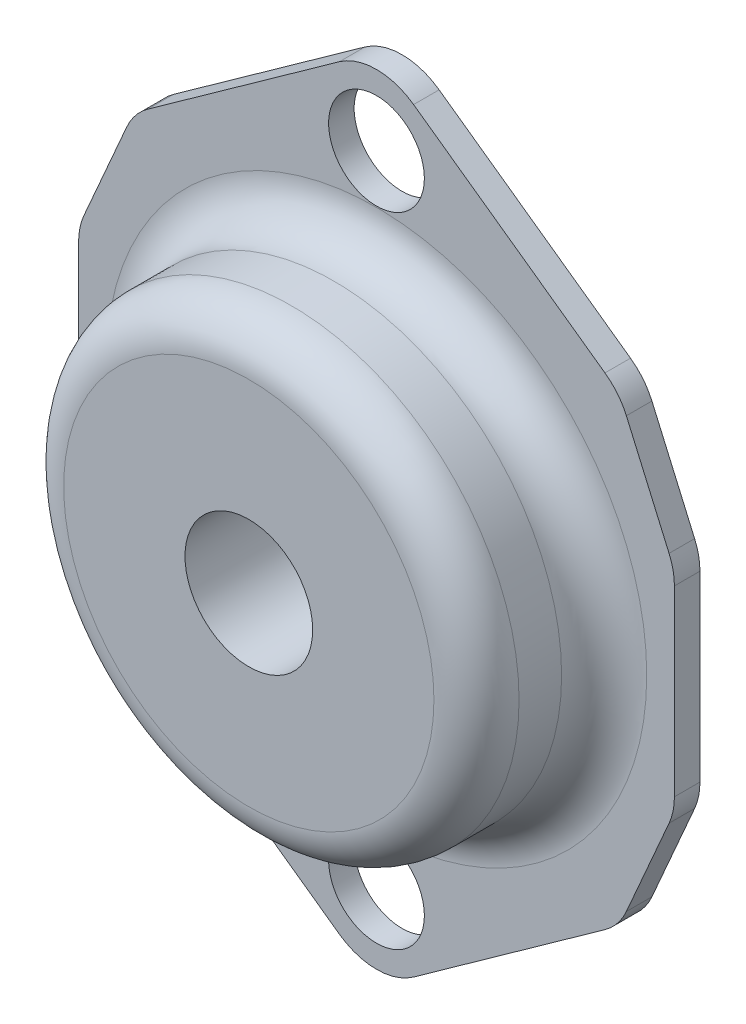
ISO-10303-21;
HEADER;
FILE_DESCRIPTION(('STEP AP214'),'2;1');
FILE_NAME('part.step','',(''),(''),'','','');
FILE_SCHEMA(('AUTOMOTIVE_DESIGN { 1 0 10303 214 1 1 1 1 }'));
ENDSEC;
DATA;
#1=APPLICATION_CONTEXT('core data for automotive mechanical design processes');
#2=APPLICATION_PROTOCOL_DEFINITION('international standard','automotive_design',2000,#1);
#3=PRODUCT_CONTEXT('',#1,'mechanical');
#4=PRODUCT('Part','Part','',(#3));
#5=PRODUCT_RELATED_PRODUCT_CATEGORY('part','',(#4));
#6=PRODUCT_DEFINITION_FORMATION('','',#4);
#7=PRODUCT_DEFINITION_CONTEXT('part definition',#1,'design');
#8=PRODUCT_DEFINITION('design','',#6,#7);
#9=PRODUCT_DEFINITION_SHAPE('','',#8);
#10=(LENGTH_UNIT() NAMED_UNIT(*) SI_UNIT(.MILLI.,.METRE.));
#11=(NAMED_UNIT(*) PLANE_ANGLE_UNIT() SI_UNIT($,.RADIAN.));
#12=(NAMED_UNIT(*) SI_UNIT($,.STERADIAN.) SOLID_ANGLE_UNIT());
#13=UNCERTAINTY_MEASURE_WITH_UNIT(LENGTH_MEASURE(1.E-05),#10,'distance_accuracy_value','');
#14=(GEOMETRIC_REPRESENTATION_CONTEXT(3) GLOBAL_UNCERTAINTY_ASSIGNED_CONTEXT((#13)) GLOBAL_UNIT_ASSIGNED_CONTEXT((#10,
#11,#12)) REPRESENTATION_CONTEXT('',''));
#15=CARTESIAN_POINT('',(0.,0.,0.));
#16=DIRECTION('',(0.,0.,1.));
#17=DIRECTION('',(1.,0.,0.));
#18=AXIS2_PLACEMENT_3D('',#15,#16,#17);
#19=CARTESIAN_POINT('',(8.98695474681683,12.5797149833493,1.2));
#20=DIRECTION('',(-0.581300041044602,-0.813689290995982,0.));
#21=DIRECTION('',(0.813689290995983,-0.581300041044602,0.));
#22=AXIS2_PLACEMENT_3D('',#19,#20,#21);
#23=PLANE('',#22);
#24=DIRECTION('',(-0.813689290995982,0.581300041044602,0.));
#25=VECTOR('',#24,1.);
#26=CARTESIAN_POINT('',(8.98695474681683,12.5797149833493,1.2));
#27=LINE('',#26,#25);
#28=CARTESIAN_POINT('',(10.7371772402966,11.3293551487599,1.2));
#29=VERTEX_POINT('',#28);
#30=CARTESIAN_POINT('',(1.7439001231338,17.7541568699835,1.2));
#31=VERTEX_POINT('',#30);
#32=EDGE_CURVE('E343',#29,#31,#27,.T.);
#33=ORIENTED_EDGE('',*,*,#32,.F.);
#34=DIRECTION('',(0.,0.,-1.));
#35=VECTOR('',#34,1.);
#36=CARTESIAN_POINT('',(10.7371772402966,11.3293551487599,1.2));
#37=LINE('',#36,#35);
#38=CARTESIAN_POINT('',(10.7371772402966,11.3293551487599,0.));
#39=VERTEX_POINT('',#38);
#40=EDGE_CURVE('E297',#29,#39,#37,.T.);
#41=ORIENTED_EDGE('',*,*,#40,.T.);
#42=DIRECTION('',(-0.813689290995982,0.581300041044602,0.));
#43=VECTOR('',#42,1.);
#44=CARTESIAN_POINT('',(8.98695474681683,12.5797149833493,0.));
#45=LINE('',#44,#43);
#46=CARTESIAN_POINT('',(1.7439001231338,17.7541568699835,0.));
#47=VERTEX_POINT('',#46);
#48=EDGE_CURVE('E373',#39,#47,#45,.T.);
#49=ORIENTED_EDGE('',*,*,#48,.T.);
#50=DIRECTION('',(0.,0.,-1.));
#51=VECTOR('',#50,1.);
#52=CARTESIAN_POINT('',(1.7439001231338,17.7541568699835,1.2));
#53=LINE('',#52,#51);
#54=EDGE_CURVE('E295',#47,#31,#53,.F.);
#55=ORIENTED_EDGE('',*,*,#54,.T.);
#56=EDGE_LOOP('',(#33,#41,#49,#55));
#57=FACE_BOUND('',#56,.T.);
#58=ADVANCED_FACE('F41',(#57),#23,.F.);
#59=CARTESIAN_POINT('',(-8.98695474681683,12.5797149833493,1.2));
#60=DIRECTION('',(-0.581300041044602,0.813689290995982,0.));
#61=DIRECTION('',(-0.813689290995983,-0.581300041044602,0.));
#62=AXIS2_PLACEMENT_3D('',#59,#60,#61);
#63=PLANE('',#62);
#64=DIRECTION('',(0.813689290995982,0.581300041044602,0.));
#65=VECTOR('',#64,1.);
#66=CARTESIAN_POINT('',(-8.98695474681683,12.5797149833493,0.));
#67=LINE('',#66,#65);
#68=CARTESIAN_POINT('',(-10.7371772402966,11.3293551487599,0.));
#69=VERTEX_POINT('',#68);
#70=CARTESIAN_POINT('',(-1.7439001231338,17.7541568699835,0.));
#71=VERTEX_POINT('',#70);
#72=EDGE_CURVE('E376',#69,#71,#67,.T.);
#73=ORIENTED_EDGE('',*,*,#72,.F.);
#74=DIRECTION('',(0.,0.,-1.));
#75=VECTOR('',#74,1.);
#76=CARTESIAN_POINT('',(-10.7371772402966,11.3293551487599,1.2));
#77=LINE('',#76,#75);
#78=CARTESIAN_POINT('',(-10.7371772402966,11.3293551487599,1.2));
#79=VERTEX_POINT('',#78);
#80=EDGE_CURVE('E308',#69,#79,#77,.F.);
#81=ORIENTED_EDGE('',*,*,#80,.T.);
#82=DIRECTION('',(0.813689290995982,0.581300041044602,0.));
#83=VECTOR('',#82,1.);
#84=CARTESIAN_POINT('',(-8.98695474681683,12.5797149833493,1.2));
#85=LINE('',#84,#83);
#86=CARTESIAN_POINT('',(-1.7439001231338,17.7541568699835,1.2));
#87=VERTEX_POINT('',#86);
#88=EDGE_CURVE('E346',#79,#87,#85,.T.);
#89=ORIENTED_EDGE('',*,*,#88,.T.);
#90=DIRECTION('',(0.,0.,-1.));
#91=VECTOR('',#90,1.);
#92=CARTESIAN_POINT('',(-1.7439001231338,17.7541568699835,0.));
#93=LINE('',#92,#91);
#94=EDGE_CURVE('E305',#87,#71,#93,.T.);
#95=ORIENTED_EDGE('',*,*,#94,.T.);
#96=EDGE_LOOP('',(#73,#81,#89,#95));
#97=FACE_BOUND('',#96,.T.);
#98=ADVANCED_FACE('F403',(#97),#63,.T.);
#99=CARTESIAN_POINT('',(-13.5622988799919,5.91998786113533,1.2));
#100=DIRECTION('',(-0.916492460327048,0.400051959329879,0.));
#101=DIRECTION('',(-0.400051959329879,-0.916492460327048,0.));
#102=AXIS2_PLACEMENT_3D('',#99,#100,#101);
#103=PLANE('',#102);
#104=DIRECTION('',(0.400051959329879,0.916492460327048,0.));
#105=VECTOR('',#104,1.);
#106=CARTESIAN_POINT('',(-13.5622988799919,5.91998786113533,0.));
#107=LINE('',#106,#105);
#108=CARTESIAN_POINT('',(-13.7494773809811,5.491174351062,0.));
#109=VERTEX_POINT('',#108);
#110=CARTESIAN_POINT('',(-11.7427544981439,10.0884431537616,0.));
#111=VERTEX_POINT('',#110);
#112=EDGE_CURVE('E213',#109,#111,#107,.T.);
#113=ORIENTED_EDGE('',*,*,#112,.F.);
#114=DIRECTION('',(0.,0.,-1.));
#115=VECTOR('',#114,1.);
#116=CARTESIAN_POINT('',(-13.7494773809811,5.491174351062,1.2));
#117=LINE('',#116,#115);
#118=CARTESIAN_POINT('',(-13.7494773809811,5.491174351062,1.2));
#119=VERTEX_POINT('',#118);
#120=EDGE_CURVE('E303',#109,#119,#117,.F.);
#121=ORIENTED_EDGE('',*,*,#120,.T.);
#122=DIRECTION('',(0.400051959329879,0.916492460327048,0.));
#123=VECTOR('',#122,1.);
#124=CARTESIAN_POINT('',(-13.5622988799919,5.91998786113533,1.2));
#125=LINE('',#124,#123);
#126=CARTESIAN_POINT('',(-11.7427544981439,10.0884431537616,1.2));
#127=VERTEX_POINT('',#126);
#128=EDGE_CURVE('E349',#119,#127,#125,.T.);
#129=ORIENTED_EDGE('',*,*,#128,.T.);
#130=DIRECTION('',(0.,0.,-1.));
#131=VECTOR('',#130,1.);
#132=CARTESIAN_POINT('',(-11.7427544981439,10.0884431537616,1.2));
#133=LINE('',#132,#131);
#134=EDGE_CURVE('E300',#127,#111,#133,.T.);
#135=ORIENTED_EDGE('',*,*,#134,.T.);
#136=EDGE_LOOP('',(#113,#121,#129,#135));
#137=FACE_BOUND('',#136,.T.);
#138=ADVANCED_FACE('F383',(#137),#103,.T.);
#139=CARTESIAN_POINT('',(-14.,0.,1.2));
#140=DIRECTION('',(-1.,0.,0.));
#141=DIRECTION('',(0.,0.,1.));
#142=AXIS2_PLACEMENT_3D('',#139,#140,#141);
#143=PLANE('',#142);
#144=DIRECTION('',(0.,1.,0.));
#145=VECTOR('',#144,1.);
#146=CARTESIAN_POINT('',(-14.,0.,0.));
#147=LINE('',#146,#145);
#148=CARTESIAN_POINT('',(-14.,-4.29101847307236,0.));
#149=VERTEX_POINT('',#148);
#150=CARTESIAN_POINT('',(-14.,4.29101847307236,0.));
#151=VERTEX_POINT('',#150);
#152=EDGE_CURVE('E208',#149,#151,#147,.T.);
#153=ORIENTED_EDGE('',*,*,#152,.F.);
#154=DIRECTION('',(0.,0.,-1.));
#155=VECTOR('',#154,1.);
#156=CARTESIAN_POINT('',(-14.,-4.29101847307236,1.2));
#157=LINE('',#156,#155);
#158=CARTESIAN_POINT('',(-14.,-4.29101847307236,1.2));
#159=VERTEX_POINT('',#158);
#160=EDGE_CURVE('E185',#149,#159,#157,.F.);
#161=ORIENTED_EDGE('',*,*,#160,.T.);
#162=DIRECTION('',(0.,1.,0.));
#163=VECTOR('',#162,1.);
#164=CARTESIAN_POINT('',(-14.,0.,1.2));
#165=LINE('',#164,#163);
#166=CARTESIAN_POINT('',(-14.,4.29101847307236,1.2));
#167=VERTEX_POINT('',#166);
#168=EDGE_CURVE('E352',#159,#167,#165,.T.);
#169=ORIENTED_EDGE('',*,*,#168,.T.);
#170=DIRECTION('',(0.,0.,-1.));
#171=VECTOR('',#170,1.);
#172=CARTESIAN_POINT('',(-14.,4.29101847307236,1.2));
#173=LINE('',#172,#171);
#174=EDGE_CURVE('E190',#167,#151,#173,.T.);
#175=ORIENTED_EDGE('',*,*,#174,.T.);
#176=EDGE_LOOP('',(#153,#161,#169,#175));
#177=FACE_BOUND('',#176,.T.);
#178=ADVANCED_FACE('F394',(#177),#143,.T.);
#179=CARTESIAN_POINT('',(-13.5622988799919,-5.91998786113533,1.2));
#180=DIRECTION('',(0.916492460327048,0.400051959329879,0.));
#181=DIRECTION('',(-0.400051959329879,0.916492460327048,0.));
#182=AXIS2_PLACEMENT_3D('',#179,#180,#181);
#183=PLANE('',#182);
#184=DIRECTION('',(0.400051959329879,-0.916492460327048,0.));
#185=VECTOR('',#184,1.);
#186=CARTESIAN_POINT('',(-13.5622988799919,-5.91998786113533,1.2));
#187=LINE('',#186,#185);
#188=CARTESIAN_POINT('',(-13.7494773809811,-5.491174351062,1.2));
#189=VERTEX_POINT('',#188);
#190=CARTESIAN_POINT('',(-11.7427544981439,-10.0884431537616,1.2));
#191=VERTEX_POINT('',#190);
#192=EDGE_CURVE('E200',#189,#191,#187,.T.);
#193=ORIENTED_EDGE('',*,*,#192,.F.);
#194=DIRECTION('',(0.,0.,-1.));
#195=VECTOR('',#194,1.);
#196=CARTESIAN_POINT('',(-13.7494773809811,-5.491174351062,0.));
#197=LINE('',#196,#195);
#198=CARTESIAN_POINT('',(-13.7494773809811,-5.491174351062,0.));
#199=VERTEX_POINT('',#198);
#200=EDGE_CURVE('E184',#189,#199,#197,.T.);
#201=ORIENTED_EDGE('',*,*,#200,.T.);
#202=DIRECTION('',(0.400051959329879,-0.916492460327048,0.));
#203=VECTOR('',#202,1.);
#204=CARTESIAN_POINT('',(-13.5622988799919,-5.91998786113533,0.));
#205=LINE('',#204,#203);
#206=CARTESIAN_POINT('',(-11.7427544981439,-10.0884431537616,0.));
#207=VERTEX_POINT('',#206);
#208=EDGE_CURVE('E197',#199,#207,#205,.T.);
#209=ORIENTED_EDGE('',*,*,#208,.T.);
#210=DIRECTION('',(0.,0.,-1.));
#211=VECTOR('',#210,1.);
#212=CARTESIAN_POINT('',(-11.7427544981439,-10.0884431537616,1.2));
#213=LINE('',#212,#211);
#214=EDGE_CURVE('E202',#207,#191,#213,.F.);
#215=ORIENTED_EDGE('',*,*,#214,.T.);
#216=EDGE_LOOP('',(#193,#201,#209,#215));
#217=FACE_BOUND('',#216,.T.);
#218=ADVANCED_FACE('F196',(#217),#183,.F.);
#219=CARTESIAN_POINT('',(-8.98695474681683,-12.5797149833493,1.2));
#220=DIRECTION('',(0.581300041044602,0.813689290995982,0.));
#221=DIRECTION('',(-0.813689290995983,0.581300041044602,0.));
#222=AXIS2_PLACEMENT_3D('',#219,#220,#221);
#223=PLANE('',#222);
#224=DIRECTION('',(0.813689290995982,-0.581300041044602,0.));
#225=VECTOR('',#224,1.);
#226=CARTESIAN_POINT('',(-8.98695474681683,-12.5797149833493,1.2));
#227=LINE('',#226,#225);
#228=CARTESIAN_POINT('',(-10.7371772402966,-11.3293551487599,1.2));
#229=VERTEX_POINT('',#228);
#230=CARTESIAN_POINT('',(-1.7439001231338,-17.7541568699835,1.2));
#231=VERTEX_POINT('',#230);
#232=EDGE_CURVE('E356',#229,#231,#227,.T.);
#233=ORIENTED_EDGE('',*,*,#232,.F.);
#234=DIRECTION('',(0.,0.,-1.));
#235=VECTOR('',#234,1.);
#236=CARTESIAN_POINT('',(-10.7371772402966,-11.3293551487599,1.2));
#237=LINE('',#236,#235);
#238=CARTESIAN_POINT('',(-10.7371772402966,-11.3293551487599,0.));
#239=VERTEX_POINT('',#238);
#240=EDGE_CURVE('E273',#229,#239,#237,.T.);
#241=ORIENTED_EDGE('',*,*,#240,.T.);
#242=DIRECTION('',(0.813689290995982,-0.581300041044602,0.));
#243=VECTOR('',#242,1.);
#244=CARTESIAN_POINT('',(-8.98695474681683,-12.5797149833493,0.));
#245=LINE('',#244,#243);
#246=CARTESIAN_POINT('',(-1.7439001231338,-17.7541568699835,0.));
#247=VERTEX_POINT('',#246);
#248=EDGE_CURVE('E207',#239,#247,#245,.T.);
#249=ORIENTED_EDGE('',*,*,#248,.T.);
#250=DIRECTION('',(0.,0.,-1.));
#251=VECTOR('',#250,1.);
#252=CARTESIAN_POINT('',(-1.7439001231338,-17.7541568699835,1.2));
#253=LINE('',#252,#251);
#254=EDGE_CURVE('E271',#247,#231,#253,.F.);
#255=ORIENTED_EDGE('',*,*,#254,.T.);
#256=EDGE_LOOP('',(#233,#241,#249,#255));
#257=FACE_BOUND('',#256,.T.);
#258=ADVANCED_FACE('F401',(#257),#223,.F.);
#259=CARTESIAN_POINT('',(8.98695474681683,-12.5797149833493,1.2));
#260=DIRECTION('',(0.581300041044602,-0.813689290995982,0.));
#261=DIRECTION('',(0.813689290995983,0.581300041044602,0.));
#262=AXIS2_PLACEMENT_3D('',#259,#260,#261);
#263=PLANE('',#262);
#264=DIRECTION('',(-0.813689290995982,-0.581300041044602,0.));
#265=VECTOR('',#264,1.);
#266=CARTESIAN_POINT('',(8.98695474681683,-12.5797149833493,1.2));
#267=LINE('',#266,#265);
#268=CARTESIAN_POINT('',(10.7371772402966,-11.3293551487599,1.2));
#269=VERTEX_POINT('',#268);
#270=CARTESIAN_POINT('',(1.7439001231338,-17.7541568699835,1.2));
#271=VERTEX_POINT('',#270);
#272=EDGE_CURVE('E359',#269,#271,#267,.T.);
#273=ORIENTED_EDGE('',*,*,#272,.T.);
#274=DIRECTION('',(0.,0.,-1.));
#275=VECTOR('',#274,1.);
#276=CARTESIAN_POINT('',(1.7439001231338,-17.7541568699835,0.));
#277=LINE('',#276,#275);
#278=CARTESIAN_POINT('',(1.7439001231338,-17.7541568699835,0.));
#279=VERTEX_POINT('',#278);
#280=EDGE_CURVE('E278',#271,#279,#277,.T.);
#281=ORIENTED_EDGE('',*,*,#280,.T.);
#282=DIRECTION('',(-0.813689290995982,-0.581300041044602,0.));
#283=VECTOR('',#282,1.);
#284=CARTESIAN_POINT('',(8.98695474681683,-12.5797149833493,0.));
#285=LINE('',#284,#283);
#286=CARTESIAN_POINT('',(10.7371772402966,-11.3293551487599,0.));
#287=VERTEX_POINT('',#286);
#288=EDGE_CURVE('E211',#287,#279,#285,.T.);
#289=ORIENTED_EDGE('',*,*,#288,.F.);
#290=DIRECTION('',(0.,0.,-1.));
#291=VECTOR('',#290,1.);
#292=CARTESIAN_POINT('',(10.7371772402966,-11.3293551487599,1.2));
#293=LINE('',#292,#291);
#294=EDGE_CURVE('E276',#287,#269,#293,.F.);
#295=ORIENTED_EDGE('',*,*,#294,.T.);
#296=EDGE_LOOP('',(#273,#281,#289,#295));
#297=FACE_BOUND('',#296,.T.);
#298=ADVANCED_FACE('F490',(#297),#263,.T.);
#299=CARTESIAN_POINT('',(13.5622988799919,-5.91998786113533,1.2));
#300=DIRECTION('',(0.916492460327048,-0.400051959329879,0.));
#301=DIRECTION('',(0.400051959329879,0.916492460327048,0.));
#302=AXIS2_PLACEMENT_3D('',#299,#300,#301);
#303=PLANE('',#302);
#304=DIRECTION('',(-0.400051959329879,-0.916492460327048,0.));
#305=VECTOR('',#304,1.);
#306=CARTESIAN_POINT('',(13.5622988799919,-5.91998786113533,1.2));
#307=LINE('',#306,#305);
#308=CARTESIAN_POINT('',(13.7494773809811,-5.491174351062,1.2));
#309=VERTEX_POINT('',#308);
#310=CARTESIAN_POINT('',(11.7427544981439,-10.0884431537616,1.2));
#311=VERTEX_POINT('',#310);
#312=EDGE_CURVE('E362',#309,#311,#307,.T.);
#313=ORIENTED_EDGE('',*,*,#312,.T.);
#314=DIRECTION('',(0.,0.,-1.));
#315=VECTOR('',#314,1.);
#316=CARTESIAN_POINT('',(11.7427544981439,-10.0884431537616,1.2));
#317=LINE('',#316,#315);
#318=CARTESIAN_POINT('',(11.7427544981439,-10.0884431537616,0.));
#319=VERTEX_POINT('',#318);
#320=EDGE_CURVE('E283',#311,#319,#317,.T.);
#321=ORIENTED_EDGE('',*,*,#320,.T.);
#322=DIRECTION('',(-0.400051959329879,-0.916492460327048,0.));
#323=VECTOR('',#322,1.);
#324=CARTESIAN_POINT('',(13.5622988799919,-5.91998786113533,0.));
#325=LINE('',#324,#323);
#326=CARTESIAN_POINT('',(13.7494773809811,-5.491174351062,0.));
#327=VERTEX_POINT('',#326);
#328=EDGE_CURVE('E219',#327,#319,#325,.T.);
#329=ORIENTED_EDGE('',*,*,#328,.F.);
#330=DIRECTION('',(0.,0.,-1.));
#331=VECTOR('',#330,1.);
#332=CARTESIAN_POINT('',(13.7494773809811,-5.491174351062,1.2));
#333=LINE('',#332,#331);
#334=EDGE_CURVE('E281',#327,#309,#333,.F.);
#335=ORIENTED_EDGE('',*,*,#334,.T.);
#336=EDGE_LOOP('',(#313,#321,#329,#335));
#337=FACE_BOUND('',#336,.T.);
#338=ADVANCED_FACE('F483',(#337),#303,.T.);
#339=CARTESIAN_POINT('',(14.,0.,1.2));
#340=DIRECTION('',(-1.,0.,0.));
#341=DIRECTION('',(0.,0.,1.));
#342=AXIS2_PLACEMENT_3D('',#339,#340,#341);
#343=PLANE('',#342);
#344=DIRECTION('',(0.,1.,0.));
#345=VECTOR('',#344,1.);
#346=CARTESIAN_POINT('',(14.,0.,1.2));
#347=LINE('',#346,#345);
#348=CARTESIAN_POINT('',(14.,-4.29101847307236,1.2));
#349=VERTEX_POINT('',#348);
#350=CARTESIAN_POINT('',(14.,4.29101847307236,1.2));
#351=VERTEX_POINT('',#350);
#352=EDGE_CURVE('E365',#349,#351,#347,.T.);
#353=ORIENTED_EDGE('',*,*,#352,.F.);
#354=DIRECTION('',(0.,0.,-1.));
#355=VECTOR('',#354,1.);
#356=CARTESIAN_POINT('',(14.,-4.29101847307236,0.));
#357=LINE('',#356,#355);
#358=CARTESIAN_POINT('',(14.,-4.29101847307236,0.));
#359=VERTEX_POINT('',#358);
#360=EDGE_CURVE('E288',#349,#359,#357,.T.);
#361=ORIENTED_EDGE('',*,*,#360,.T.);
#362=DIRECTION('',(0.,1.,0.));
#363=VECTOR('',#362,1.);
#364=CARTESIAN_POINT('',(14.,0.,0.));
#365=LINE('',#364,#363);
#366=CARTESIAN_POINT('',(14.,4.29101847307236,0.));
#367=VERTEX_POINT('',#366);
#368=EDGE_CURVE('E222',#359,#367,#365,.T.);
#369=ORIENTED_EDGE('',*,*,#368,.T.);
#370=DIRECTION('',(0.,0.,-1.));
#371=VECTOR('',#370,1.);
#372=CARTESIAN_POINT('',(14.,4.29101847307236,1.2));
#373=LINE('',#372,#371);
#374=EDGE_CURVE('E286',#367,#351,#373,.F.);
#375=ORIENTED_EDGE('',*,*,#374,.T.);
#376=EDGE_LOOP('',(#353,#361,#369,#375));
#377=FACE_BOUND('',#376,.T.);
#378=ADVANCED_FACE('F477',(#377),#343,.F.);
#379=CARTESIAN_POINT('',(13.5622988799919,5.91998786113533,1.2));
#380=DIRECTION('',(-0.916492460327048,-0.400051959329879,0.));
#381=DIRECTION('',(0.400051959329879,-0.916492460327048,0.));
#382=AXIS2_PLACEMENT_3D('',#379,#380,#381);
#383=PLANE('',#382);
#384=DIRECTION('',(-0.400051959329879,0.916492460327048,0.));
#385=VECTOR('',#384,1.);
#386=CARTESIAN_POINT('',(13.5622988799919,5.91998786113533,1.2));
#387=LINE('',#386,#385);
#388=CARTESIAN_POINT('',(13.7494773809811,5.491174351062,1.2));
#389=VERTEX_POINT('',#388);
#390=CARTESIAN_POINT('',(11.7427544981439,10.0884431537616,1.2));
#391=VERTEX_POINT('',#390);
#392=EDGE_CURVE('E367',#389,#391,#387,.T.);
#393=ORIENTED_EDGE('',*,*,#392,.F.);
#394=DIRECTION('',(0.,0.,-1.));
#395=VECTOR('',#394,1.);
#396=CARTESIAN_POINT('',(13.7494773809811,5.491174351062,1.2));
#397=LINE('',#396,#395);
#398=CARTESIAN_POINT('',(13.7494773809811,5.491174351062,0.));
#399=VERTEX_POINT('',#398);
#400=EDGE_CURVE('E292',#389,#399,#397,.T.);
#401=ORIENTED_EDGE('',*,*,#400,.T.);
#402=DIRECTION('',(-0.400051959329879,0.916492460327048,0.));
#403=VECTOR('',#402,1.);
#404=CARTESIAN_POINT('',(13.5622988799919,5.91998786113533,0.));
#405=LINE('',#404,#403);
#406=CARTESIAN_POINT('',(11.7427544981439,10.0884431537616,0.));
#407=VERTEX_POINT('',#406);
#408=EDGE_CURVE('E225',#399,#407,#405,.T.);
#409=ORIENTED_EDGE('',*,*,#408,.T.);
#410=DIRECTION('',(0.,0.,-1.));
#411=VECTOR('',#410,1.);
#412=CARTESIAN_POINT('',(11.7427544981439,10.0884431537616,1.2));
#413=LINE('',#412,#411);
#414=EDGE_CURVE('E56',#407,#391,#413,.F.);
#415=ORIENTED_EDGE('',*,*,#414,.T.);
#416=EDGE_LOOP('',(#393,#401,#409,#415));
#417=FACE_BOUND('',#416,.T.);
#418=ADVANCED_FACE('F420',(#417),#383,.F.);
#419=CARTESIAN_POINT('',(0.,15.,1.2));
#420=DIRECTION('',(0.,0.,-1.));
#421=DIRECTION('',(-1.,0.,0.));
#422=AXIS2_PLACEMENT_3D('',#419,#420,#421);
#423=CYLINDRICAL_SURFACE('',#422,2.25);
#424=CARTESIAN_POINT('',(0.,15.,1.2));
#425=DIRECTION('',(0.,0.,1.));
#426=DIRECTION('',(1.,0.,0.));
#427=AXIS2_PLACEMENT_3D('',#424,#425,#426);
#428=CIRCLE('',#427,2.25);
#429=CARTESIAN_POINT('',(2.25,15.,1.2));
#430=VERTEX_POINT('',#429);
#431=EDGE_CURVE('E230',#430,#430,#428,.T.);
#432=ORIENTED_EDGE('',*,*,#431,.T.);
#433=EDGE_LOOP('',(#432));
#434=FACE_BOUND('',#433,.T.);
#435=CARTESIAN_POINT('',(0.,15.,0.));
#436=DIRECTION('',(0.,0.,1.));
#437=DIRECTION('',(1.,0.,0.));
#438=AXIS2_PLACEMENT_3D('',#435,#436,#437);
#439=CIRCLE('',#438,2.25);
#440=CARTESIAN_POINT('',(2.25,15.,0.));
#441=VERTEX_POINT('',#440);
#442=EDGE_CURVE('E338',#441,#441,#439,.T.);
#443=ORIENTED_EDGE('',*,*,#442,.F.);
#444=EDGE_LOOP('',(#443));
#445=FACE_BOUND('',#444,.T.);
#446=ADVANCED_FACE('F416',(#434,#445),#423,.F.);
#447=CARTESIAN_POINT('',(0.,0.,1.2));
#448=DIRECTION('',(0.,0.,-1.));
#449=DIRECTION('',(-1.,0.,0.));
#450=AXIS2_PLACEMENT_3D('',#447,#448,#449);
#451=CYLINDRICAL_SURFACE('',#450,3.);
#452=CARTESIAN_POINT('',(0.,0.,0.));
#453=DIRECTION('',(0.,0.,1.));
#454=DIRECTION('',(1.,0.,0.));
#455=AXIS2_PLACEMENT_3D('',#452,#453,#454);
#456=CIRCLE('',#455,3.);
#457=CARTESIAN_POINT('',(3.,0.,0.));
#458=VERTEX_POINT('',#457);
#459=EDGE_CURVE('E335',#458,#458,#456,.T.);
#460=ORIENTED_EDGE('',*,*,#459,.F.);
#461=EDGE_LOOP('',(#460));
#462=FACE_BOUND('',#461,.T.);
#463=CARTESIAN_POINT('',(0.,0.,7.2));
#464=DIRECTION('',(0.,0.,1.));
#465=DIRECTION('',(1.,0.,0.));
#466=AXIS2_PLACEMENT_3D('',#463,#464,#465);
#467=CIRCLE('',#466,3.);
#468=CARTESIAN_POINT('',(3.,0.,7.2));
#469=VERTEX_POINT('',#468);
#470=EDGE_CURVE('E333',#469,#469,#467,.F.);
#471=ORIENTED_EDGE('',*,*,#470,.F.);
#472=EDGE_LOOP('',(#471));
#473=FACE_BOUND('',#472,.T.);
#474=ADVANCED_FACE('F419',(#462,#473),#451,.F.);
#475=CARTESIAN_POINT('',(0.,-15.,1.2));
#476=DIRECTION('',(0.,0.,-1.));
#477=DIRECTION('',(-1.,0.,0.));
#478=AXIS2_PLACEMENT_3D('',#475,#476,#477);
#479=CYLINDRICAL_SURFACE('',#478,2.25);
#480=CARTESIAN_POINT('',(0.,-15.,1.2));
#481=DIRECTION('',(0.,0.,1.));
#482=DIRECTION('',(1.,0.,0.));
#483=AXIS2_PLACEMENT_3D('',#480,#481,#482);
#484=CIRCLE('',#483,2.25);
#485=CARTESIAN_POINT('',(2.25,-15.,1.2));
#486=VERTEX_POINT('',#485);
#487=EDGE_CURVE('E231',#486,#486,#484,.T.);
#488=ORIENTED_EDGE('',*,*,#487,.T.);
#489=EDGE_LOOP('',(#488));
#490=FACE_BOUND('',#489,.T.);
#491=CARTESIAN_POINT('',(0.,-15.,0.));
#492=DIRECTION('',(0.,0.,1.));
#493=DIRECTION('',(1.,0.,0.));
#494=AXIS2_PLACEMENT_3D('',#491,#492,#493);
#495=CIRCLE('',#494,2.25);
#496=CARTESIAN_POINT('',(2.25,-15.,0.));
#497=VERTEX_POINT('',#496);
#498=EDGE_CURVE('E227',#497,#497,#495,.T.);
#499=ORIENTED_EDGE('',*,*,#498,.F.);
#500=EDGE_LOOP('',(#499));
#501=FACE_BOUND('',#500,.T.);
#502=ADVANCED_FACE('F424',(#490,#501),#479,.F.);
#503=CARTESIAN_POINT('',(0.,0.,1.2));
#504=DIRECTION('',(0.,0.,1.));
#505=DIRECTION('',(1.,0.,0.));
#506=AXIS2_PLACEMENT_3D('',#503,#504,#505);
#507=PLANE('',#506);
#508=CARTESIAN_POINT('',(0.,0.,1.2));
#509=DIRECTION('',(0.,0.,1.));
#510=DIRECTION('',(1.,0.,0.));
#511=AXIS2_PLACEMENT_3D('',#508,#509,#510);
#512=CIRCLE('',#511,12.7);
#513=CARTESIAN_POINT('',(12.7,0.,1.2));
#514=VERTEX_POINT('',#513);
#515=EDGE_CURVE('E11',#514,#514,#512,.F.);
#516=ORIENTED_EDGE('',*,*,#515,.T.);
#517=EDGE_LOOP('',(#516));
#518=FACE_BOUND('',#517,.T.);
#519=ORIENTED_EDGE('',*,*,#431,.F.);
#520=EDGE_LOOP('',(#519));
#521=FACE_BOUND('',#520,.T.);
#522=ORIENTED_EDGE('',*,*,#168,.F.);
#523=CARTESIAN_POINT('',(-11.,-4.29101847307236,1.2));
#524=DIRECTION('',(0.,0.,1.));
#525=DIRECTION('',(1.,0.,0.));
#526=AXIS2_PLACEMENT_3D('',#523,#524,#525);
#527=CIRCLE('',#526,3.);
#528=EDGE_CURVE('E269',#159,#189,#527,.T.);
#529=ORIENTED_EDGE('',*,*,#528,.T.);
#530=ORIENTED_EDGE('',*,*,#192,.T.);
#531=CARTESIAN_POINT('',(-8.99327711716276,-8.88828727577193,1.2));
#532=DIRECTION('',(0.,0.,1.));
#533=DIRECTION('',(1.,0.,0.));
#534=AXIS2_PLACEMENT_3D('',#531,#532,#533);
#535=CIRCLE('',#534,3.);
#536=EDGE_CURVE('E267',#191,#229,#535,.T.);
#537=ORIENTED_EDGE('',*,*,#536,.T.);
#538=ORIENTED_EDGE('',*,*,#232,.T.);
#539=CARTESIAN_POINT('',(0.,-15.3130889969955,1.2));
#540=DIRECTION('',(0.,0.,1.));
#541=DIRECTION('',(1.,0.,0.));
#542=AXIS2_PLACEMENT_3D('',#539,#540,#541);
#543=CIRCLE('',#542,3.);
#544=EDGE_CURVE('E265',#231,#271,#543,.T.);
#545=ORIENTED_EDGE('',*,*,#544,.T.);
#546=ORIENTED_EDGE('',*,*,#272,.F.);
#547=CARTESIAN_POINT('',(8.99327711716276,-8.88828727577193,1.2));
#548=DIRECTION('',(0.,0.,1.));
#549=DIRECTION('',(1.,0.,0.));
#550=AXIS2_PLACEMENT_3D('',#547,#548,#549);
#551=CIRCLE('',#550,3.);
#552=EDGE_CURVE('E263',#269,#311,#551,.T.);
#553=ORIENTED_EDGE('',*,*,#552,.T.);
#554=ORIENTED_EDGE('',*,*,#312,.F.);
#555=CARTESIAN_POINT('',(11.,-4.29101847307236,1.2));
#556=DIRECTION('',(0.,0.,1.));
#557=DIRECTION('',(1.,0.,0.));
#558=AXIS2_PLACEMENT_3D('',#555,#556,#557);
#559=CIRCLE('',#558,3.);
#560=EDGE_CURVE('E261',#309,#349,#559,.T.);
#561=ORIENTED_EDGE('',*,*,#560,.T.);
#562=ORIENTED_EDGE('',*,*,#352,.T.);
#563=CARTESIAN_POINT('',(11.,4.29101847307236,1.2));
#564=DIRECTION('',(0.,0.,1.));
#565=DIRECTION('',(1.,0.,0.));
#566=AXIS2_PLACEMENT_3D('',#563,#564,#565);
#567=CIRCLE('',#566,3.);
#568=EDGE_CURVE('E63',#351,#389,#567,.T.);
#569=ORIENTED_EDGE('',*,*,#568,.T.);
#570=ORIENTED_EDGE('',*,*,#392,.T.);
#571=CARTESIAN_POINT('',(8.99327711716276,8.88828727577193,1.2));
#572=DIRECTION('',(0.,0.,1.));
#573=DIRECTION('',(1.,0.,0.));
#574=AXIS2_PLACEMENT_3D('',#571,#572,#573);
#575=CIRCLE('',#574,3.);
#576=EDGE_CURVE('E258',#391,#29,#575,.T.);
#577=ORIENTED_EDGE('',*,*,#576,.T.);
#578=ORIENTED_EDGE('',*,*,#32,.T.);
#579=CARTESIAN_POINT('',(0.,15.3130889969955,1.2));
#580=DIRECTION('',(0.,0.,1.));
#581=DIRECTION('',(1.,0.,0.));
#582=AXIS2_PLACEMENT_3D('',#579,#580,#581);
#583=CIRCLE('',#582,3.);
#584=EDGE_CURVE('E252',#31,#87,#583,.T.);
#585=ORIENTED_EDGE('',*,*,#584,.T.);
#586=ORIENTED_EDGE('',*,*,#88,.F.);
#587=CARTESIAN_POINT('',(-8.99327711716276,8.88828727577193,1.2));
#588=DIRECTION('',(0.,0.,1.));
#589=DIRECTION('',(1.,0.,0.));
#590=AXIS2_PLACEMENT_3D('',#587,#588,#589);
#591=CIRCLE('',#590,3.);
#592=EDGE_CURVE('E254',#79,#127,#591,.T.);
#593=ORIENTED_EDGE('',*,*,#592,.T.);
#594=ORIENTED_EDGE('',*,*,#128,.F.);
#595=CARTESIAN_POINT('',(-11.,4.29101847307236,1.2));
#596=DIRECTION('',(0.,0.,1.));
#597=DIRECTION('',(1.,0.,0.));
#598=AXIS2_PLACEMENT_3D('',#595,#596,#597);
#599=CIRCLE('',#598,3.);
#600=EDGE_CURVE('E256',#119,#167,#599,.T.);
#601=ORIENTED_EDGE('',*,*,#600,.T.);
#602=EDGE_LOOP('',(#522,#529,#530,#537,#538,#545,#546,#553,#554,#561,#562,#569,#570,#577,#578,
#585,#586,#593,#594,#601));
#603=FACE_BOUND('',#602,.T.);
#604=ORIENTED_EDGE('',*,*,#487,.F.);
#605=EDGE_LOOP('',(#604));
#606=FACE_BOUND('',#605,.T.);
#607=ADVANCED_FACE('F391',(#518,#521,#603,#606),#507,.T.);
#608=CARTESIAN_POINT('',(0.,0.,0.));
#609=DIRECTION('',(0.,0.,1.));
#610=DIRECTION('',(1.,0.,0.));
#611=AXIS2_PLACEMENT_3D('',#608,#609,#610);
#612=PLANE('',#611);
#613=ORIENTED_EDGE('',*,*,#459,.T.);
#614=EDGE_LOOP('',(#613));
#615=FACE_BOUND('',#614,.T.);
#616=ORIENTED_EDGE('',*,*,#442,.T.);
#617=EDGE_LOOP('',(#616));
#618=FACE_BOUND('',#617,.T.);
#619=ORIENTED_EDGE('',*,*,#208,.F.);
#620=CARTESIAN_POINT('',(-11.,-4.29101847307236,0.));
#621=DIRECTION('',(0.,0.,1.));
#622=DIRECTION('',(1.,0.,0.));
#623=AXIS2_PLACEMENT_3D('',#620,#621,#622);
#624=CIRCLE('',#623,3.);
#625=EDGE_CURVE('E180',#199,#149,#624,.F.);
#626=ORIENTED_EDGE('',*,*,#625,.T.);
#627=ORIENTED_EDGE('',*,*,#152,.T.);
#628=CARTESIAN_POINT('',(-11.,4.29101847307236,0.));
#629=DIRECTION('',(0.,0.,1.));
#630=DIRECTION('',(1.,0.,0.));
#631=AXIS2_PLACEMENT_3D('',#628,#629,#630);
#632=CIRCLE('',#631,3.);
#633=EDGE_CURVE('E236',#151,#109,#632,.F.);
#634=ORIENTED_EDGE('',*,*,#633,.T.);
#635=ORIENTED_EDGE('',*,*,#112,.T.);
#636=CARTESIAN_POINT('',(-8.99327711716276,8.88828727577193,0.));
#637=DIRECTION('',(0.,0.,1.));
#638=DIRECTION('',(1.,0.,0.));
#639=AXIS2_PLACEMENT_3D('',#636,#637,#638);
#640=CIRCLE('',#639,3.);
#641=EDGE_CURVE('E234',#111,#69,#640,.F.);
#642=ORIENTED_EDGE('',*,*,#641,.T.);
#643=ORIENTED_EDGE('',*,*,#72,.T.);
#644=CARTESIAN_POINT('',(0.,15.3130889969955,0.));
#645=DIRECTION('',(0.,0.,1.));
#646=DIRECTION('',(1.,0.,0.));
#647=AXIS2_PLACEMENT_3D('',#644,#645,#646);
#648=CIRCLE('',#647,3.);
#649=EDGE_CURVE('E201',#71,#47,#648,.F.);
#650=ORIENTED_EDGE('',*,*,#649,.T.);
#651=ORIENTED_EDGE('',*,*,#48,.F.);
#652=CARTESIAN_POINT('',(8.99327711716276,8.88828727577193,0.));
#653=DIRECTION('',(0.,0.,1.));
#654=DIRECTION('',(1.,0.,0.));
#655=AXIS2_PLACEMENT_3D('',#652,#653,#654);
#656=CIRCLE('',#655,3.);
#657=EDGE_CURVE('E238',#39,#407,#656,.F.);
#658=ORIENTED_EDGE('',*,*,#657,.T.);
#659=ORIENTED_EDGE('',*,*,#408,.F.);
#660=CARTESIAN_POINT('',(11.,4.29101847307236,0.));
#661=DIRECTION('',(0.,0.,1.));
#662=DIRECTION('',(1.,0.,0.));
#663=AXIS2_PLACEMENT_3D('',#660,#661,#662);
#664=CIRCLE('',#663,3.);
#665=EDGE_CURVE('E240',#399,#367,#664,.F.);
#666=ORIENTED_EDGE('',*,*,#665,.T.);
#667=ORIENTED_EDGE('',*,*,#368,.F.);
#668=CARTESIAN_POINT('',(11.,-4.29101847307236,0.));
#669=DIRECTION('',(0.,0.,1.));
#670=DIRECTION('',(1.,0.,0.));
#671=AXIS2_PLACEMENT_3D('',#668,#669,#670);
#672=CIRCLE('',#671,3.);
#673=EDGE_CURVE('E242',#359,#327,#672,.F.);
#674=ORIENTED_EDGE('',*,*,#673,.T.);
#675=ORIENTED_EDGE('',*,*,#328,.T.);
#676=CARTESIAN_POINT('',(8.99327711716276,-8.88828727577193,0.));
#677=DIRECTION('',(0.,0.,1.));
#678=DIRECTION('',(1.,0.,0.));
#679=AXIS2_PLACEMENT_3D('',#676,#677,#678);
#680=CIRCLE('',#679,3.);
#681=EDGE_CURVE('E244',#319,#287,#680,.F.);
#682=ORIENTED_EDGE('',*,*,#681,.T.);
#683=ORIENTED_EDGE('',*,*,#288,.T.);
#684=CARTESIAN_POINT('',(0.,-15.3130889969955,0.));
#685=DIRECTION('',(0.,0.,1.));
#686=DIRECTION('',(1.,0.,0.));
#687=AXIS2_PLACEMENT_3D('',#684,#685,#686);
#688=CIRCLE('',#687,3.);
#689=EDGE_CURVE('E246',#279,#247,#688,.F.);
#690=ORIENTED_EDGE('',*,*,#689,.T.);
#691=ORIENTED_EDGE('',*,*,#248,.F.);
#692=CARTESIAN_POINT('',(-8.99327711716276,-8.88828727577193,0.));
#693=DIRECTION('',(0.,0.,1.));
#694=DIRECTION('',(1.,0.,0.));
#695=AXIS2_PLACEMENT_3D('',#692,#693,#694);
#696=CIRCLE('',#695,3.);
#697=EDGE_CURVE('E191',#239,#207,#696,.F.);
#698=ORIENTED_EDGE('',*,*,#697,.T.);
#699=EDGE_LOOP('',(#619,#626,#627,#634,#635,#642,#643,#650,#651,#658,#659,#666,#667,#674,#675,
#682,#683,#690,#691,#698));
#700=FACE_BOUND('',#699,.T.);
#701=ORIENTED_EDGE('',*,*,#498,.T.);
#702=EDGE_LOOP('',(#701));
#703=FACE_BOUND('',#702,.T.);
#704=ADVANCED_FACE('F204',(#615,#618,#700,#703),#612,.F.);
#705=CARTESIAN_POINT('',(-11.,-4.29101847307236,1.2));
#706=DIRECTION('',(0.,0.,1.));
#707=DIRECTION('',(1.,0.,0.));
#708=AXIS2_PLACEMENT_3D('',#705,#706,#707);
#709=CYLINDRICAL_SURFACE('',#708,3.);
#710=ORIENTED_EDGE('',*,*,#528,.F.);
#711=ORIENTED_EDGE('',*,*,#160,.F.);
#712=ORIENTED_EDGE('',*,*,#625,.F.);
#713=ORIENTED_EDGE('',*,*,#200,.F.);
#714=EDGE_LOOP('',(#710,#711,#712,#713));
#715=FACE_BOUND('',#714,.T.);
#716=ADVANCED_FACE('F183',(#715),#709,.T.);
#717=CARTESIAN_POINT('',(-8.99327711716276,-8.88828727577193,1.2));
#718=DIRECTION('',(0.,0.,-1.));
#719=DIRECTION('',(-1.,0.,0.));
#720=AXIS2_PLACEMENT_3D('',#717,#718,#719);
#721=CYLINDRICAL_SURFACE('',#720,3.);
#722=ORIENTED_EDGE('',*,*,#536,.F.);
#723=ORIENTED_EDGE('',*,*,#214,.F.);
#724=ORIENTED_EDGE('',*,*,#697,.F.);
#725=ORIENTED_EDGE('',*,*,#240,.F.);
#726=EDGE_LOOP('',(#722,#723,#724,#725));
#727=FACE_BOUND('',#726,.T.);
#728=ADVANCED_FACE('F428',(#727),#721,.T.);
#729=CARTESIAN_POINT('',(0.,-15.3130889969955,1.2));
#730=DIRECTION('',(0.,0.,1.));
#731=DIRECTION('',(1.,0.,0.));
#732=AXIS2_PLACEMENT_3D('',#729,#730,#731);
#733=CYLINDRICAL_SURFACE('',#732,3.);
#734=ORIENTED_EDGE('',*,*,#544,.F.);
#735=ORIENTED_EDGE('',*,*,#254,.F.);
#736=ORIENTED_EDGE('',*,*,#689,.F.);
#737=ORIENTED_EDGE('',*,*,#280,.F.);
#738=EDGE_LOOP('',(#734,#735,#736,#737));
#739=FACE_BOUND('',#738,.T.);
#740=ADVANCED_FACE('F431',(#739),#733,.T.);
#741=CARTESIAN_POINT('',(8.99327711716276,-8.88828727577193,1.2));
#742=DIRECTION('',(0.,0.,-1.));
#743=DIRECTION('',(-1.,0.,0.));
#744=AXIS2_PLACEMENT_3D('',#741,#742,#743);
#745=CYLINDRICAL_SURFACE('',#744,3.);
#746=ORIENTED_EDGE('',*,*,#552,.F.);
#747=ORIENTED_EDGE('',*,*,#294,.F.);
#748=ORIENTED_EDGE('',*,*,#681,.F.);
#749=ORIENTED_EDGE('',*,*,#320,.F.);
#750=EDGE_LOOP('',(#746,#747,#748,#749));
#751=FACE_BOUND('',#750,.T.);
#752=ADVANCED_FACE('F435',(#751),#745,.T.);
#753=CARTESIAN_POINT('',(11.,-4.29101847307236,1.2));
#754=DIRECTION('',(0.,0.,1.));
#755=DIRECTION('',(1.,0.,0.));
#756=AXIS2_PLACEMENT_3D('',#753,#754,#755);
#757=CYLINDRICAL_SURFACE('',#756,3.);
#758=ORIENTED_EDGE('',*,*,#560,.F.);
#759=ORIENTED_EDGE('',*,*,#334,.F.);
#760=ORIENTED_EDGE('',*,*,#673,.F.);
#761=ORIENTED_EDGE('',*,*,#360,.F.);
#762=EDGE_LOOP('',(#758,#759,#760,#761));
#763=FACE_BOUND('',#762,.T.);
#764=ADVANCED_FACE('F439',(#763),#757,.T.);
#765=CARTESIAN_POINT('',(11.,4.29101847307236,1.2));
#766=DIRECTION('',(0.,0.,-1.));
#767=DIRECTION('',(-1.,0.,0.));
#768=AXIS2_PLACEMENT_3D('',#765,#766,#767);
#769=CYLINDRICAL_SURFACE('',#768,3.);
#770=ORIENTED_EDGE('',*,*,#568,.F.);
#771=ORIENTED_EDGE('',*,*,#374,.F.);
#772=ORIENTED_EDGE('',*,*,#665,.F.);
#773=ORIENTED_EDGE('',*,*,#400,.F.);
#774=EDGE_LOOP('',(#770,#771,#772,#773));
#775=FACE_BOUND('',#774,.T.);
#776=ADVANCED_FACE('F443',(#775),#769,.T.);
#777=CARTESIAN_POINT('',(8.99327711716276,8.88828727577193,1.2));
#778=DIRECTION('',(0.,0.,-1.));
#779=DIRECTION('',(-1.,0.,0.));
#780=AXIS2_PLACEMENT_3D('',#777,#778,#779);
#781=CYLINDRICAL_SURFACE('',#780,3.);
#782=ORIENTED_EDGE('',*,*,#576,.F.);
#783=ORIENTED_EDGE('',*,*,#414,.F.);
#784=ORIENTED_EDGE('',*,*,#657,.F.);
#785=ORIENTED_EDGE('',*,*,#40,.F.);
#786=EDGE_LOOP('',(#782,#783,#784,#785));
#787=FACE_BOUND('',#786,.T.);
#788=ADVANCED_FACE('F447',(#787),#781,.T.);
#789=CARTESIAN_POINT('',(-11.,4.29101847307236,1.2));
#790=DIRECTION('',(0.,0.,-1.));
#791=DIRECTION('',(-1.,0.,0.));
#792=AXIS2_PLACEMENT_3D('',#789,#790,#791);
#793=CYLINDRICAL_SURFACE('',#792,3.);
#794=ORIENTED_EDGE('',*,*,#600,.F.);
#795=ORIENTED_EDGE('',*,*,#120,.F.);
#796=ORIENTED_EDGE('',*,*,#633,.F.);
#797=ORIENTED_EDGE('',*,*,#174,.F.);
#798=EDGE_LOOP('',(#794,#795,#796,#797));
#799=FACE_BOUND('',#798,.T.);
#800=ADVANCED_FACE('F388',(#799),#793,.T.);
#801=CARTESIAN_POINT('',(-8.99327711716276,8.88828727577193,1.2));
#802=DIRECTION('',(0.,0.,-1.));
#803=DIRECTION('',(-1.,0.,0.));
#804=AXIS2_PLACEMENT_3D('',#801,#802,#803);
#805=CYLINDRICAL_SURFACE('',#804,3.);
#806=ORIENTED_EDGE('',*,*,#592,.F.);
#807=ORIENTED_EDGE('',*,*,#80,.F.);
#808=ORIENTED_EDGE('',*,*,#641,.F.);
#809=ORIENTED_EDGE('',*,*,#134,.F.);
#810=EDGE_LOOP('',(#806,#807,#808,#809));
#811=FACE_BOUND('',#810,.T.);
#812=ADVANCED_FACE('F454',(#811),#805,.T.);
#813=CARTESIAN_POINT('',(0.,15.3130889969955,1.2));
#814=DIRECTION('',(0.,0.,1.));
#815=DIRECTION('',(1.,0.,0.));
#816=AXIS2_PLACEMENT_3D('',#813,#814,#815);
#817=CYLINDRICAL_SURFACE('',#816,3.);
#818=ORIENTED_EDGE('',*,*,#584,.F.);
#819=ORIENTED_EDGE('',*,*,#54,.F.);
#820=ORIENTED_EDGE('',*,*,#649,.F.);
#821=ORIENTED_EDGE('',*,*,#94,.F.);
#822=EDGE_LOOP('',(#818,#819,#820,#821));
#823=FACE_BOUND('',#822,.T.);
#824=ADVANCED_FACE('F329',(#823),#817,.T.);
#825=CARTESIAN_POINT('',(0.,0.,7.2));
#826=DIRECTION('',(0.,0.,1.));
#827=DIRECTION('',(1.,0.,0.));
#828=AXIS2_PLACEMENT_3D('',#825,#826,#827);
#829=PLANE('',#828);
#830=CARTESIAN_POINT('',(0.,0.,7.2));
#831=DIRECTION('',(0.,0.,1.));
#832=DIRECTION('',(1.,0.,0.));
#833=AXIS2_PLACEMENT_3D('',#830,#831,#832);
#834=CIRCLE('',#833,8.7);
#835=CARTESIAN_POINT('',(8.7,0.,7.2));
#836=VERTEX_POINT('',#835);
#837=EDGE_CURVE('E310',#836,#836,#834,.T.);
#838=ORIENTED_EDGE('',*,*,#837,.T.);
#839=EDGE_LOOP('',(#838));
#840=FACE_BOUND('',#839,.T.);
#841=ORIENTED_EDGE('',*,*,#470,.T.);
#842=EDGE_LOOP('',(#841));
#843=FACE_BOUND('',#842,.T.);
#844=ADVANCED_FACE('F326',(#840,#843),#829,.T.);
#845=CARTESIAN_POINT('',(0.,0.,7.2));
#846=DIRECTION('',(0.,0.,-1.));
#847=DIRECTION('',(-1.,0.,0.));
#848=AXIS2_PLACEMENT_3D('',#845,#846,#847);
#849=CYLINDRICAL_SURFACE('',#848,10.7);
#850=CARTESIAN_POINT('',(0.,0.,5.2));
#851=DIRECTION('',(0.,0.,1.));
#852=DIRECTION('',(1.,0.,0.));
#853=AXIS2_PLACEMENT_3D('',#850,#851,#852);
#854=CIRCLE('',#853,10.7);
#855=CARTESIAN_POINT('',(10.7,0.,5.2));
#856=VERTEX_POINT('',#855);
#857=EDGE_CURVE('E49',#856,#856,#854,.F.);
#858=ORIENTED_EDGE('',*,*,#857,.T.);
#859=EDGE_LOOP('',(#858));
#860=FACE_BOUND('',#859,.T.);
#861=CARTESIAN_POINT('',(0.,0.,3.2));
#862=DIRECTION('',(0.,0.,1.));
#863=DIRECTION('',(1.,0.,0.));
#864=AXIS2_PLACEMENT_3D('',#861,#862,#863);
#865=CIRCLE('',#864,10.7);
#866=CARTESIAN_POINT('',(10.7,0.,3.2));
#867=VERTEX_POINT('',#866);
#868=EDGE_CURVE('E313',#867,#867,#865,.T.);
#869=ORIENTED_EDGE('',*,*,#868,.T.);
#870=EDGE_LOOP('',(#869));
#871=FACE_BOUND('',#870,.T.);
#872=ADVANCED_FACE('F318',(#860,#871),#849,.T.);
#873=CARTESIAN_POINT('',(0.,0.,5.2));
#874=DIRECTION('',(0.,0.,1.));
#875=DIRECTION('',(1.,0.,0.));
#876=AXIS2_PLACEMENT_3D('',#873,#874,#875);
#877=TOROIDAL_SURFACE('',#876,8.7,2.);
#878=ORIENTED_EDGE('',*,*,#857,.F.);
#879=EDGE_LOOP('',(#878));
#880=FACE_BOUND('',#879,.T.);
#881=ORIENTED_EDGE('',*,*,#837,.F.);
#882=EDGE_LOOP('',(#881));
#883=FACE_BOUND('',#882,.T.);
#884=ADVANCED_FACE('F321',(#880,#883),#877,.T.);
#885=CARTESIAN_POINT('',(0.,0.,3.2));
#886=DIRECTION('',(0.,0.,1.));
#887=DIRECTION('',(1.,0.,0.));
#888=AXIS2_PLACEMENT_3D('',#885,#886,#887);
#889=TOROIDAL_SURFACE('',#888,12.7,2.);
#890=ORIENTED_EDGE('',*,*,#515,.F.);
#891=EDGE_LOOP('',(#890));
#892=FACE_BOUND('',#891,.T.);
#893=ORIENTED_EDGE('',*,*,#868,.F.);
#894=EDGE_LOOP('',(#893));
#895=FACE_BOUND('',#894,.T.);
#896=ADVANCED_FACE('F43',(#892,#895),#889,.F.);
#897=CLOSED_SHELL('',(#58,#98,#138,#178,#218,#258,#298,#338,#378,#418,#446,#474,#502,#607,#704,
#716,#728,#740,#752,#764,#776,#788,#800,#812,#824,#844,#872,#884,#896));
#898=MANIFOLD_SOLID_BREP('B2',#897);
#899=ADVANCED_BREP_SHAPE_REPRESENTATION('',(#18,#898),#14);
#900=SHAPE_DEFINITION_REPRESENTATION(#9,#899);
ENDSEC;
END-ISO-10303-21;
